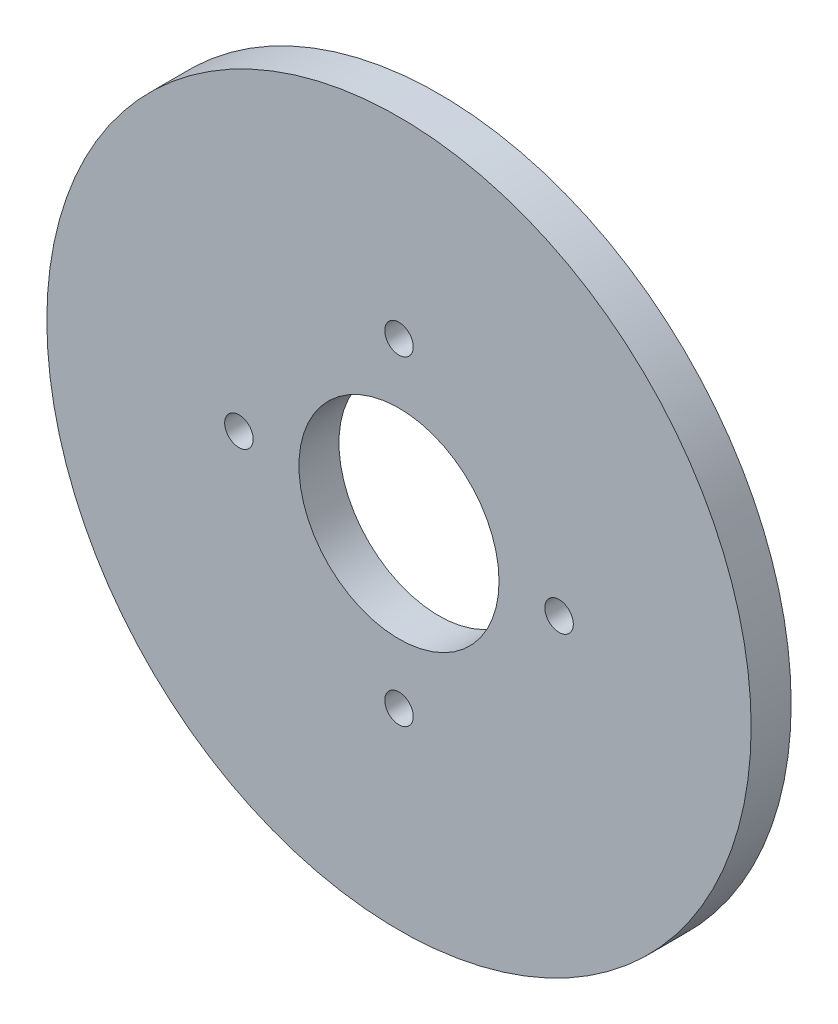
ISO-10303-21;
HEADER;
FILE_DESCRIPTION(('STEP AP214'),'2;1');
FILE_NAME('part.step','',(''),(''),'','','');
FILE_SCHEMA(('AUTOMOTIVE_DESIGN { 1 0 10303 214 1 1 1 1 }'));
ENDSEC;
DATA;
#1=APPLICATION_CONTEXT('core data for automotive mechanical design processes');
#2=APPLICATION_PROTOCOL_DEFINITION('international standard','automotive_design',2000,#1);
#3=PRODUCT_CONTEXT('',#1,'mechanical');
#4=PRODUCT('Part','Part','',(#3));
#5=PRODUCT_RELATED_PRODUCT_CATEGORY('part','',(#4));
#6=PRODUCT_DEFINITION_FORMATION('','',#4);
#7=PRODUCT_DEFINITION_CONTEXT('part definition',#1,'design');
#8=PRODUCT_DEFINITION('design','',#6,#7);
#9=PRODUCT_DEFINITION_SHAPE('','',#8);
#10=(LENGTH_UNIT() NAMED_UNIT(*) SI_UNIT(.MILLI.,.METRE.));
#11=(NAMED_UNIT(*) PLANE_ANGLE_UNIT() SI_UNIT($,.RADIAN.));
#12=(NAMED_UNIT(*) SI_UNIT($,.STERADIAN.) SOLID_ANGLE_UNIT());
#13=UNCERTAINTY_MEASURE_WITH_UNIT(LENGTH_MEASURE(1.E-05),#10,'distance_accuracy_value','');
#14=(GEOMETRIC_REPRESENTATION_CONTEXT(3) GLOBAL_UNCERTAINTY_ASSIGNED_CONTEXT((#13)) GLOBAL_UNIT_ASSIGNED_CONTEXT((#10,
#11,#12)) REPRESENTATION_CONTEXT('',''));
#15=CARTESIAN_POINT('',(0.,0.,0.));
#16=DIRECTION('',(0.,0.,1.));
#17=DIRECTION('',(1.,0.,0.));
#18=AXIS2_PLACEMENT_3D('',#15,#16,#17);
#19=CARTESIAN_POINT('',(0.,0.,3.175));
#20=DIRECTION('',(0.,0.,1.));
#21=DIRECTION('',(1.,0.,0.));
#22=AXIS2_PLACEMENT_3D('',#19,#20,#21);
#23=PLANE('',#22);
#24=CARTESIAN_POINT('',(0.,12.7,3.175));
#25=DIRECTION('',(0.,0.,1.));
#26=DIRECTION('',(1.,0.,0.));
#27=AXIS2_PLACEMENT_3D('',#24,#25,#26);
#28=CIRCLE('',#27,1.1303);
#29=CARTESIAN_POINT('',(1.1303,12.7,3.175));
#30=VERTEX_POINT('',#29);
#31=EDGE_CURVE('E70',#30,#30,#28,.T.);
#32=ORIENTED_EDGE('',*,*,#31,.F.);
#33=EDGE_LOOP('',(#32));
#34=FACE_BOUND('',#33,.T.);
#35=CARTESIAN_POINT('',(0.,-12.7,3.175));
#36=DIRECTION('',(0.,0.,1.));
#37=DIRECTION('',(1.,0.,0.));
#38=AXIS2_PLACEMENT_3D('',#35,#36,#37);
#39=CIRCLE('',#38,1.1303);
#40=CARTESIAN_POINT('',(1.1303,-12.7,3.175));
#41=VERTEX_POINT('',#40);
#42=EDGE_CURVE('E64',#41,#41,#39,.T.);
#43=ORIENTED_EDGE('',*,*,#42,.F.);
#44=EDGE_LOOP('',(#43));
#45=FACE_BOUND('',#44,.T.);
#46=CARTESIAN_POINT('',(12.7,0.,3.175));
#47=DIRECTION('',(0.,0.,1.));
#48=DIRECTION('',(1.,0.,0.));
#49=AXIS2_PLACEMENT_3D('',#46,#47,#48);
#50=CIRCLE('',#49,1.1303);
#51=CARTESIAN_POINT('',(13.8303,0.,3.175));
#52=VERTEX_POINT('',#51);
#53=EDGE_CURVE('E58',#52,#52,#50,.T.);
#54=ORIENTED_EDGE('',*,*,#53,.F.);
#55=EDGE_LOOP('',(#54));
#56=FACE_BOUND('',#55,.T.);
#57=CARTESIAN_POINT('',(-12.7,0.,3.175));
#58=DIRECTION('',(0.,0.,1.));
#59=DIRECTION('',(1.,0.,0.));
#60=AXIS2_PLACEMENT_3D('',#57,#58,#59);
#61=CIRCLE('',#60,1.1303);
#62=CARTESIAN_POINT('',(-11.5697,0.,3.175));
#63=VERTEX_POINT('',#62);
#64=EDGE_CURVE('E52',#63,#63,#61,.T.);
#65=ORIENTED_EDGE('',*,*,#64,.F.);
#66=EDGE_LOOP('',(#65));
#67=FACE_BOUND('',#66,.T.);
#68=CARTESIAN_POINT('',(0.,0.,3.175));
#69=DIRECTION('',(0.,0.,1.));
#70=DIRECTION('',(1.,0.,0.));
#71=AXIS2_PLACEMENT_3D('',#68,#69,#70);
#72=CIRCLE('',#71,27.94);
#73=CARTESIAN_POINT('',(27.94,0.,3.175));
#74=VERTEX_POINT('',#73);
#75=EDGE_CURVE('E10',#74,#74,#72,.T.);
#76=ORIENTED_EDGE('',*,*,#75,.T.);
#77=EDGE_LOOP('',(#76));
#78=FACE_BOUND('',#77,.T.);
#79=CARTESIAN_POINT('',(0.,0.,3.175));
#80=DIRECTION('',(0.,0.,1.));
#81=DIRECTION('',(1.,0.,0.));
#82=AXIS2_PLACEMENT_3D('',#79,#80,#81);
#83=CIRCLE('',#82,7.9375);
#84=CARTESIAN_POINT('',(7.9375,0.,3.175));
#85=VERTEX_POINT('',#84);
#86=EDGE_CURVE('E42',#85,#85,#83,.T.);
#87=ORIENTED_EDGE('',*,*,#86,.F.);
#88=EDGE_LOOP('',(#87));
#89=FACE_BOUND('',#88,.T.);
#90=ADVANCED_FACE('F31',(#34,#45,#56,#67,#78,#89),#23,.T.);
#91=CARTESIAN_POINT('',(0.,0.,0.));
#92=DIRECTION('',(0.,0.,1.));
#93=DIRECTION('',(1.,0.,0.));
#94=AXIS2_PLACEMENT_3D('',#91,#92,#93);
#95=PLANE('',#94);
#96=CARTESIAN_POINT('',(0.,12.7,0.));
#97=DIRECTION('',(0.,0.,1.));
#98=DIRECTION('',(1.,0.,0.));
#99=AXIS2_PLACEMENT_3D('',#96,#97,#98);
#100=CIRCLE('',#99,1.1303);
#101=CARTESIAN_POINT('',(1.1303,12.7,0.));
#102=VERTEX_POINT('',#101);
#103=EDGE_CURVE('E67',#102,#102,#100,.T.);
#104=ORIENTED_EDGE('',*,*,#103,.T.);
#105=EDGE_LOOP('',(#104));
#106=FACE_BOUND('',#105,.T.);
#107=CARTESIAN_POINT('',(0.,-12.7,0.));
#108=DIRECTION('',(0.,0.,1.));
#109=DIRECTION('',(1.,0.,0.));
#110=AXIS2_PLACEMENT_3D('',#107,#108,#109);
#111=CIRCLE('',#110,1.1303);
#112=CARTESIAN_POINT('',(1.1303,-12.7,0.));
#113=VERTEX_POINT('',#112);
#114=EDGE_CURVE('E61',#113,#113,#111,.T.);
#115=ORIENTED_EDGE('',*,*,#114,.T.);
#116=EDGE_LOOP('',(#115));
#117=FACE_BOUND('',#116,.T.);
#118=CARTESIAN_POINT('',(12.7,0.,0.));
#119=DIRECTION('',(0.,0.,1.));
#120=DIRECTION('',(1.,0.,0.));
#121=AXIS2_PLACEMENT_3D('',#118,#119,#120);
#122=CIRCLE('',#121,1.1303);
#123=CARTESIAN_POINT('',(13.8303,0.,0.));
#124=VERTEX_POINT('',#123);
#125=EDGE_CURVE('E55',#124,#124,#122,.T.);
#126=ORIENTED_EDGE('',*,*,#125,.T.);
#127=EDGE_LOOP('',(#126));
#128=FACE_BOUND('',#127,.T.);
#129=CARTESIAN_POINT('',(-12.7,0.,0.));
#130=DIRECTION('',(0.,0.,1.));
#131=DIRECTION('',(1.,0.,0.));
#132=AXIS2_PLACEMENT_3D('',#129,#130,#131);
#133=CIRCLE('',#132,1.1303);
#134=CARTESIAN_POINT('',(-11.5697,0.,0.));
#135=VERTEX_POINT('',#134);
#136=EDGE_CURVE('E47',#135,#135,#133,.T.);
#137=ORIENTED_EDGE('',*,*,#136,.T.);
#138=EDGE_LOOP('',(#137));
#139=FACE_BOUND('',#138,.T.);
#140=CARTESIAN_POINT('',(0.,0.,0.));
#141=DIRECTION('',(0.,0.,1.));
#142=DIRECTION('',(1.,0.,0.));
#143=AXIS2_PLACEMENT_3D('',#140,#141,#142);
#144=CIRCLE('',#143,27.94);
#145=CARTESIAN_POINT('',(27.94,0.,0.));
#146=VERTEX_POINT('',#145);
#147=EDGE_CURVE('E35',#146,#146,#144,.T.);
#148=ORIENTED_EDGE('',*,*,#147,.F.);
#149=EDGE_LOOP('',(#148));
#150=FACE_BOUND('',#149,.T.);
#151=CARTESIAN_POINT('',(0.,0.,0.));
#152=DIRECTION('',(0.,0.,1.));
#153=DIRECTION('',(1.,0.,0.));
#154=AXIS2_PLACEMENT_3D('',#151,#152,#153);
#155=CIRCLE('',#154,7.9375);
#156=CARTESIAN_POINT('',(7.9375,0.,0.));
#157=VERTEX_POINT('',#156);
#158=EDGE_CURVE('E44',#157,#157,#155,.T.);
#159=ORIENTED_EDGE('',*,*,#158,.T.);
#160=EDGE_LOOP('',(#159));
#161=FACE_BOUND('',#160,.T.);
#162=ADVANCED_FACE('F79',(#106,#117,#128,#139,#150,#161),#95,.F.);
#163=CARTESIAN_POINT('',(0.,0.,3.175));
#164=DIRECTION('',(0.,0.,-1.));
#165=DIRECTION('',(-1.,0.,0.));
#166=AXIS2_PLACEMENT_3D('',#163,#164,#165);
#167=CYLINDRICAL_SURFACE('',#166,27.94);
#168=ORIENTED_EDGE('',*,*,#75,.F.);
#169=EDGE_LOOP('',(#168));
#170=FACE_BOUND('',#169,.T.);
#171=ORIENTED_EDGE('',*,*,#147,.T.);
#172=EDGE_LOOP('',(#171));
#173=FACE_BOUND('',#172,.T.);
#174=ADVANCED_FACE('F33',(#170,#173),#167,.T.);
#175=CARTESIAN_POINT('',(0.,0.,3.175));
#176=DIRECTION('',(0.,0.,-1.));
#177=DIRECTION('',(-1.,0.,0.));
#178=AXIS2_PLACEMENT_3D('',#175,#176,#177);
#179=CYLINDRICAL_SURFACE('',#178,7.9375);
#180=ORIENTED_EDGE('',*,*,#86,.T.);
#181=EDGE_LOOP('',(#180));
#182=FACE_BOUND('',#181,.T.);
#183=ORIENTED_EDGE('',*,*,#158,.F.);
#184=EDGE_LOOP('',(#183));
#185=FACE_BOUND('',#184,.T.);
#186=ADVANCED_FACE('F89',(#182,#185),#179,.F.);
#187=CARTESIAN_POINT('',(-12.7,0.,3.175));
#188=DIRECTION('',(0.,0.,1.));
#189=DIRECTION('',(1.,0.,0.));
#190=AXIS2_PLACEMENT_3D('',#187,#188,#189);
#191=CYLINDRICAL_SURFACE('',#190,1.1303);
#192=ORIENTED_EDGE('',*,*,#64,.T.);
#193=EDGE_LOOP('',(#192));
#194=FACE_BOUND('',#193,.T.);
#195=ORIENTED_EDGE('',*,*,#136,.F.);
#196=EDGE_LOOP('',(#195));
#197=FACE_BOUND('',#196,.T.);
#198=ADVANCED_FACE('F92',(#194,#197),#191,.F.);
#199=CARTESIAN_POINT('',(12.7,0.,3.175));
#200=DIRECTION('',(0.,0.,1.));
#201=DIRECTION('',(1.,0.,0.));
#202=AXIS2_PLACEMENT_3D('',#199,#200,#201);
#203=CYLINDRICAL_SURFACE('',#202,1.1303);
#204=ORIENTED_EDGE('',*,*,#53,.T.);
#205=EDGE_LOOP('',(#204));
#206=FACE_BOUND('',#205,.T.);
#207=ORIENTED_EDGE('',*,*,#125,.F.);
#208=EDGE_LOOP('',(#207));
#209=FACE_BOUND('',#208,.T.);
#210=ADVANCED_FACE('F106',(#206,#209),#203,.F.);
#211=CARTESIAN_POINT('',(0.,-12.7,3.175));
#212=DIRECTION('',(0.,0.,1.));
#213=DIRECTION('',(1.,0.,0.));
#214=AXIS2_PLACEMENT_3D('',#211,#212,#213);
#215=CYLINDRICAL_SURFACE('',#214,1.1303);
#216=ORIENTED_EDGE('',*,*,#42,.T.);
#217=EDGE_LOOP('',(#216));
#218=FACE_BOUND('',#217,.T.);
#219=ORIENTED_EDGE('',*,*,#114,.F.);
#220=EDGE_LOOP('',(#219));
#221=FACE_BOUND('',#220,.T.);
#222=ADVANCED_FACE('F110',(#218,#221),#215,.F.);
#223=CARTESIAN_POINT('',(0.,12.7,3.175));
#224=DIRECTION('',(0.,0.,1.));
#225=DIRECTION('',(1.,0.,0.));
#226=AXIS2_PLACEMENT_3D('',#223,#224,#225);
#227=CYLINDRICAL_SURFACE('',#226,1.1303);
#228=ORIENTED_EDGE('',*,*,#31,.T.);
#229=EDGE_LOOP('',(#228));
#230=FACE_BOUND('',#229,.T.);
#231=ORIENTED_EDGE('',*,*,#103,.F.);
#232=EDGE_LOOP('',(#231));
#233=FACE_BOUND('',#232,.T.);
#234=ADVANCED_FACE('F74',(#230,#233),#227,.F.);
#235=CLOSED_SHELL('',(#90,#162,#174,#186,#198,#210,#222,#234));
#236=MANIFOLD_SOLID_BREP('B2',#235);
#237=ADVANCED_BREP_SHAPE_REPRESENTATION('',(#18,#236),#14);
#238=SHAPE_DEFINITION_REPRESENTATION(#9,#237);
ENDSEC;
END-ISO-10303-21;
